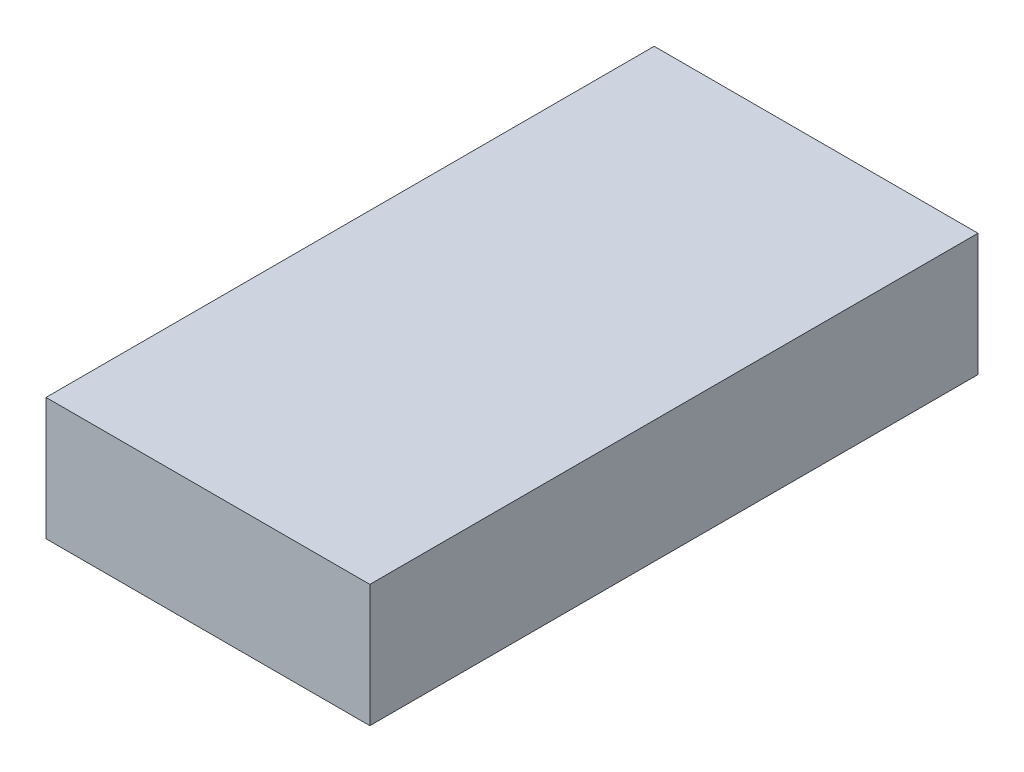
ISO-10303-21;
HEADER;
FILE_DESCRIPTION(('STEP AP214'),'2;1');
FILE_NAME('part.step','',(''),(''),'','','');
FILE_SCHEMA(('AUTOMOTIVE_DESIGN { 1 0 10303 214 1 1 1 1 }'));
ENDSEC;
DATA;
#1=APPLICATION_CONTEXT('core data for automotive mechanical design processes');
#2=APPLICATION_PROTOCOL_DEFINITION('international standard','automotive_design',2000,#1);
#3=PRODUCT_CONTEXT('',#1,'mechanical');
#4=PRODUCT('Part','Part','',(#3));
#5=PRODUCT_RELATED_PRODUCT_CATEGORY('part','',(#4));
#6=PRODUCT_DEFINITION_FORMATION('','',#4);
#7=PRODUCT_DEFINITION_CONTEXT('part definition',#1,'design');
#8=PRODUCT_DEFINITION('design','',#6,#7);
#9=PRODUCT_DEFINITION_SHAPE('','',#8);
#10=(LENGTH_UNIT() NAMED_UNIT(*) SI_UNIT(.MILLI.,.METRE.));
#11=(NAMED_UNIT(*) PLANE_ANGLE_UNIT() SI_UNIT($,.RADIAN.));
#12=(NAMED_UNIT(*) SI_UNIT($,.STERADIAN.) SOLID_ANGLE_UNIT());
#13=UNCERTAINTY_MEASURE_WITH_UNIT(LENGTH_MEASURE(1.E-05),#10,'distance_accuracy_value','');
#14=(GEOMETRIC_REPRESENTATION_CONTEXT(3) GLOBAL_UNCERTAINTY_ASSIGNED_CONTEXT((#13)) GLOBAL_UNIT_ASSIGNED_CONTEXT((#10,
#11,#12)) REPRESENTATION_CONTEXT('',''));
#15=CARTESIAN_POINT('',(0.,0.,0.));
#16=DIRECTION('',(0.,0.,1.));
#17=DIRECTION('',(1.,0.,0.));
#18=AXIS2_PLACEMENT_3D('',#15,#16,#17);
#19=CARTESIAN_POINT('',(41.,0.,0.));
#20=DIRECTION('',(0.,0.,-1.));
#21=DIRECTION('',(-1.,0.,0.));
#22=AXIS2_PLACEMENT_3D('',#19,#20,#21);
#23=PLANE('',#22);
#24=DIRECTION('',(0.,-1.,0.));
#25=VECTOR('',#24,1.);
#26=CARTESIAN_POINT('',(0.,0.,0.));
#27=LINE('',#26,#25);
#28=CARTESIAN_POINT('',(0.,15.5,0.));
#29=VERTEX_POINT('',#28);
#30=CARTESIAN_POINT('',(0.,0.,0.));
#31=VERTEX_POINT('',#30);
#32=EDGE_CURVE('E99',#29,#31,#27,.T.);
#33=ORIENTED_EDGE('',*,*,#32,.T.);
#34=DIRECTION('',(-1.,0.,0.));
#35=VECTOR('',#34,1.);
#36=CARTESIAN_POINT('',(41.,0.,0.));
#37=LINE('',#36,#35);
#38=CARTESIAN_POINT('',(41.,0.,0.));
#39=VERTEX_POINT('',#38);
#40=EDGE_CURVE('E11',#39,#31,#37,.T.);
#41=ORIENTED_EDGE('',*,*,#40,.F.);
#42=DIRECTION('',(0.,-1.,0.));
#43=VECTOR('',#42,1.);
#44=CARTESIAN_POINT('',(41.,0.,0.));
#45=LINE('',#44,#43);
#46=CARTESIAN_POINT('',(41.,15.5,0.));
#47=VERTEX_POINT('',#46);
#48=EDGE_CURVE('E87',#47,#39,#45,.T.);
#49=ORIENTED_EDGE('',*,*,#48,.F.);
#50=DIRECTION('',(-1.,0.,0.));
#51=VECTOR('',#50,1.);
#52=CARTESIAN_POINT('',(41.,15.5,0.));
#53=LINE('',#52,#51);
#54=EDGE_CURVE('E95',#47,#29,#53,.T.);
#55=ORIENTED_EDGE('',*,*,#54,.T.);
#56=EDGE_LOOP('',(#33,#41,#49,#55));
#57=FACE_BOUND('',#56,.T.);
#58=ADVANCED_FACE('F36',(#57),#23,.F.);
#59=CARTESIAN_POINT('',(41.,0.,0.));
#60=DIRECTION('',(0.,1.,0.));
#61=DIRECTION('',(0.,0.,1.));
#62=AXIS2_PLACEMENT_3D('',#59,#60,#61);
#63=PLANE('',#62);
#64=DIRECTION('',(0.,0.,-1.));
#65=VECTOR('',#64,1.);
#66=CARTESIAN_POINT('',(0.,0.,0.));
#67=LINE('',#66,#65);
#68=CARTESIAN_POINT('',(0.,0.,-77.));
#69=VERTEX_POINT('',#68);
#70=EDGE_CURVE('E91',#31,#69,#67,.T.);
#71=ORIENTED_EDGE('',*,*,#70,.T.);
#72=DIRECTION('',(-1.,0.,0.));
#73=VECTOR('',#72,1.);
#74=CARTESIAN_POINT('',(41.,0.,-77.));
#75=LINE('',#74,#73);
#76=CARTESIAN_POINT('',(41.,0.,-77.));
#77=VERTEX_POINT('',#76);
#78=EDGE_CURVE('E44',#77,#69,#75,.T.);
#79=ORIENTED_EDGE('',*,*,#78,.F.);
#80=DIRECTION('',(0.,0.,-1.));
#81=VECTOR('',#80,1.);
#82=CARTESIAN_POINT('',(41.,0.,0.));
#83=LINE('',#82,#81);
#84=EDGE_CURVE('E82',#39,#77,#83,.T.);
#85=ORIENTED_EDGE('',*,*,#84,.F.);
#86=ORIENTED_EDGE('',*,*,#40,.T.);
#87=EDGE_LOOP('',(#71,#79,#85,#86));
#88=FACE_BOUND('',#87,.T.);
#89=ADVANCED_FACE('F90',(#88),#63,.F.);
#90=CARTESIAN_POINT('',(41.,0.,-77.));
#91=DIRECTION('',(0.,0.,1.));
#92=DIRECTION('',(1.,0.,0.));
#93=AXIS2_PLACEMENT_3D('',#90,#91,#92);
#94=PLANE('',#93);
#95=DIRECTION('',(0.,1.,0.));
#96=VECTOR('',#95,1.);
#97=CARTESIAN_POINT('',(0.,0.,-77.));
#98=LINE('',#97,#96);
#99=CARTESIAN_POINT('',(0.,15.5,-77.));
#100=VERTEX_POINT('',#99);
#101=EDGE_CURVE('E69',#69,#100,#98,.T.);
#102=ORIENTED_EDGE('',*,*,#101,.T.);
#103=DIRECTION('',(-1.,0.,0.));
#104=VECTOR('',#103,1.);
#105=CARTESIAN_POINT('',(41.,15.5,-77.));
#106=LINE('',#105,#104);
#107=CARTESIAN_POINT('',(41.,15.5,-77.));
#108=VERTEX_POINT('',#107);
#109=EDGE_CURVE('E92',#108,#100,#106,.T.);
#110=ORIENTED_EDGE('',*,*,#109,.F.);
#111=DIRECTION('',(0.,1.,0.));
#112=VECTOR('',#111,1.);
#113=CARTESIAN_POINT('',(41.,0.,-77.));
#114=LINE('',#113,#112);
#115=EDGE_CURVE('E85',#77,#108,#114,.T.);
#116=ORIENTED_EDGE('',*,*,#115,.F.);
#117=ORIENTED_EDGE('',*,*,#78,.T.);
#118=EDGE_LOOP('',(#102,#110,#116,#117));
#119=FACE_BOUND('',#118,.T.);
#120=ADVANCED_FACE('F93',(#119),#94,.F.);
#121=CARTESIAN_POINT('',(41.,15.5,0.));
#122=DIRECTION('',(0.,-1.,0.));
#123=DIRECTION('',(0.,0.,-1.));
#124=AXIS2_PLACEMENT_3D('',#121,#122,#123);
#125=PLANE('',#124);
#126=DIRECTION('',(0.,0.,1.));
#127=VECTOR('',#126,1.);
#128=CARTESIAN_POINT('',(0.,15.5,0.));
#129=LINE('',#128,#127);
#130=EDGE_CURVE('E75',#100,#29,#129,.T.);
#131=ORIENTED_EDGE('',*,*,#130,.T.);
#132=ORIENTED_EDGE('',*,*,#54,.F.);
#133=DIRECTION('',(0.,0.,1.));
#134=VECTOR('',#133,1.);
#135=CARTESIAN_POINT('',(41.,15.5,0.));
#136=LINE('',#135,#134);
#137=EDGE_CURVE('E52',#108,#47,#136,.T.);
#138=ORIENTED_EDGE('',*,*,#137,.F.);
#139=ORIENTED_EDGE('',*,*,#109,.T.);
#140=EDGE_LOOP('',(#131,#132,#138,#139));
#141=FACE_BOUND('',#140,.T.);
#142=ADVANCED_FACE('F106',(#141),#125,.F.);
#143=CARTESIAN_POINT('',(41.,0.,0.));
#144=DIRECTION('',(-1.,0.,0.));
#145=DIRECTION('',(0.,0.,1.));
#146=AXIS2_PLACEMENT_3D('',#143,#144,#145);
#147=PLANE('',#146);
#148=ORIENTED_EDGE('',*,*,#48,.T.);
#149=ORIENTED_EDGE('',*,*,#84,.T.);
#150=ORIENTED_EDGE('',*,*,#115,.T.);
#151=ORIENTED_EDGE('',*,*,#137,.T.);
#152=EDGE_LOOP('',(#148,#149,#150,#151));
#153=FACE_BOUND('',#152,.T.);
#154=ADVANCED_FACE('F83',(#153),#147,.F.);
#155=CARTESIAN_POINT('',(0.,0.,0.));
#156=DIRECTION('',(-1.,0.,0.));
#157=DIRECTION('',(0.,0.,1.));
#158=AXIS2_PLACEMENT_3D('',#155,#156,#157);
#159=PLANE('',#158);
#160=ORIENTED_EDGE('',*,*,#32,.F.);
#161=ORIENTED_EDGE('',*,*,#130,.F.);
#162=ORIENTED_EDGE('',*,*,#101,.F.);
#163=ORIENTED_EDGE('',*,*,#70,.F.);
#164=EDGE_LOOP('',(#160,#161,#162,#163));
#165=FACE_BOUND('',#164,.T.);
#166=ADVANCED_FACE('F109',(#165),#159,.T.);
#167=CLOSED_SHELL('',(#58,#89,#120,#142,#154,#166));
#168=MANIFOLD_SOLID_BREP('B2',#167);
#169=ADVANCED_BREP_SHAPE_REPRESENTATION('',(#18,#168),#14);
#170=SHAPE_DEFINITION_REPRESENTATION(#9,#169);
ENDSEC;
END-ISO-10303-21;
